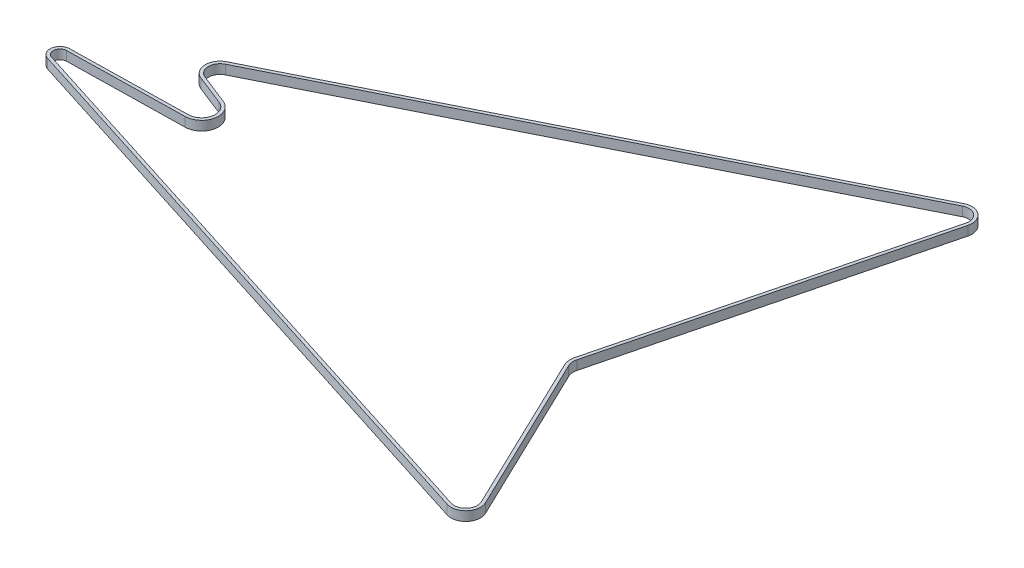
ISO-10303-21;
HEADER;
FILE_DESCRIPTION(('STEP AP214'),'2;1');
FILE_NAME('part.step','',(''),(''),'','','');
FILE_SCHEMA(('AUTOMOTIVE_DESIGN { 1 0 10303 214 1 1 1 1 }'));
ENDSEC;
DATA;
#1=APPLICATION_CONTEXT('core data for automotive mechanical design processes');
#2=APPLICATION_PROTOCOL_DEFINITION('international standard','automotive_design',2000,#1);
#3=PRODUCT_CONTEXT('',#1,'mechanical');
#4=PRODUCT('Part','Part','',(#3));
#5=PRODUCT_RELATED_PRODUCT_CATEGORY('part','',(#4));
#6=PRODUCT_DEFINITION_FORMATION('','',#4);
#7=PRODUCT_DEFINITION_CONTEXT('part definition',#1,'design');
#8=PRODUCT_DEFINITION('design','',#6,#7);
#9=PRODUCT_DEFINITION_SHAPE('','',#8);
#10=(LENGTH_UNIT() NAMED_UNIT(*) SI_UNIT(.MILLI.,.METRE.));
#11=(NAMED_UNIT(*) PLANE_ANGLE_UNIT() SI_UNIT($,.RADIAN.));
#12=(NAMED_UNIT(*) SI_UNIT($,.STERADIAN.) SOLID_ANGLE_UNIT());
#13=UNCERTAINTY_MEASURE_WITH_UNIT(LENGTH_MEASURE(1.E-05),#10,'distance_accuracy_value','');
#14=(GEOMETRIC_REPRESENTATION_CONTEXT(3) GLOBAL_UNCERTAINTY_ASSIGNED_CONTEXT((#13)) GLOBAL_UNIT_ASSIGNED_CONTEXT((#10,
#11,#12)) REPRESENTATION_CONTEXT('',''));
#15=CARTESIAN_POINT('',(0.,0.,0.));
#16=DIRECTION('',(0.,0.,1.));
#17=DIRECTION('',(1.,0.,0.));
#18=AXIS2_PLACEMENT_3D('',#15,#16,#17);
#19=CARTESIAN_POINT('',(-158.225,92.7999999999997,-9.6511576564019E-13));
#20=DIRECTION('',(0.,1.,0.));
#21=DIRECTION('',(0.,0.,1.));
#22=AXIS2_PLACEMENT_3D('',#19,#20,#21);
#23=PLANE('',#22);
#24=CARTESIAN_POINT('',(-158.225,92.7999999999997,-9.6511576564019E-13));
#25=DIRECTION('',(0.,1.,0.));
#26=DIRECTION('',(1.,0.,0.));
#27=AXIS2_PLACEMENT_3D('',#24,#25,#26);
#28=CIRCLE('',#27,9.49999999999995);
#29=CARTESIAN_POINT('',(-162.47352915725,92.7999999999997,-8.4970583145));
#30=VERTEX_POINT('',#29);
#31=CARTESIAN_POINT('',(-161.707213549348,92.7999999999997,8.83878887612533));
#32=VERTEX_POINT('',#31);
#33=EDGE_CURVE('E359',#30,#32,#28,.T.);
#34=ORIENTED_EDGE('',*,*,#33,.T.);
#35=DIRECTION('',(0.930398829065899,0.,0.366548794668329));
#36=VECTOR('',#35,1.);
#37=CARTESIAN_POINT('',(-161.707213549348,92.7999999999997,8.83878887612533));
#38=LINE('',#37,#36);
#39=CARTESIAN_POINT('',(-142.25017332858,92.7999999999997,16.5042699772744));
#40=VERTEX_POINT('',#39);
#41=EDGE_CURVE('E362',#32,#40,#38,.T.);
#42=ORIENTED_EDGE('',*,*,#41,.T.);
#43=CARTESIAN_POINT('',(-145.457475281927,92.7999999999997,24.6452597316012));
#44=DIRECTION('',(0.,1.,0.));
#45=DIRECTION('',(1.,0.,0.));
#46=AXIS2_PLACEMENT_3D('',#43,#44,#45);
#47=CIRCLE('',#46,8.75);
#48=CARTESIAN_POINT('',(-145.296171508246,92.7999999999997,33.3937728105533));
#49=VERTEX_POINT('',#48);
#50=EDGE_CURVE('E365',#40,#49,#47,.F.);
#51=ORIENTED_EDGE('',*,*,#50,.T.);
#52=DIRECTION('',(-0.999830066165956,0.,0.0184347169921266));
#53=VECTOR('',#52,1.);
#54=CARTESIAN_POINT('',(-145.296171508246,92.7999999999997,33.3937728105533));
#55=LINE('',#54,#53);
#56=CARTESIAN_POINT('',(-220.267521320825,92.7999999999997,34.7760833281921));
#57=VERTEX_POINT('',#56);
#58=EDGE_CURVE('E367',#49,#57,#55,.T.);
#59=ORIENTED_EDGE('',*,*,#58,.T.);
#60=CARTESIAN_POINT('',(-220.15,92.7999999999997,41.15));
#61=DIRECTION('',(0.,1.,0.));
#62=DIRECTION('',(1.,0.,0.));
#63=AXIS2_PLACEMENT_3D('',#60,#61,#62);
#64=CIRCLE('',#63,6.375);
#65=CARTESIAN_POINT('',(-222.082372691016,92.7999999999997,47.2250770186901));
#66=VERTEX_POINT('',#65);
#67=EDGE_CURVE('E369',#57,#66,#64,.T.);
#68=ORIENTED_EDGE('',*,*,#67,.T.);
#69=DIRECTION('',(0.952953257833734,0.,0.303117284865236));
#70=VECTOR('',#69,1.);
#71=CARTESIAN_POINT('',(-222.082372691016,92.7999999999997,47.2250770186901));
#72=LINE('',#71,#70);
#73=CARTESIAN_POINT('',(155.345385793781,92.7999999999997,167.27805594942));
#74=VERTEX_POINT('',#73);
#75=EDGE_CURVE('E371',#66,#74,#72,.T.);
#76=ORIENTED_EDGE('',*,*,#75,.T.);
#77=CARTESIAN_POINT('',(158.225,92.7999999999997,158.224999999999));
#78=DIRECTION('',(0.,1.,0.));
#79=DIRECTION('',(1.,0.,0.));
#80=AXIS2_PLACEMENT_3D('',#77,#78,#79);
#81=CIRCLE('',#80,9.49999999999991);
#82=CARTESIAN_POINT('',(166.786864341702,92.7999999999997,154.108632791612));
#83=VERTEX_POINT('',#82);
#84=EDGE_CURVE('E373',#74,#83,#81,.T.);
#85=ORIENTED_EDGE('',*,*,#84,.T.);
#86=DIRECTION('',(-0.433301811409341,0.,-0.901248878073856));
#87=VECTOR('',#86,1.);
#88=CARTESIAN_POINT('',(117.114072316854,92.7999999999997,50.7913908498316));
#89=LINE('',#88,#87);
#90=CARTESIAN_POINT('',(117.114072316854,92.7999999999997,50.7913908498316));
#91=VERTEX_POINT('',#90);
#92=EDGE_CURVE('E375',#83,#91,#89,.T.);
#93=ORIENTED_EDGE('',*,*,#92,.T.);
#94=CARTESIAN_POINT('',(125.,92.7999999999997,47.));
#95=DIRECTION('',(0.,1.,0.));
#96=DIRECTION('',(1.,0.,0.));
#97=AXIS2_PLACEMENT_3D('',#94,#95,#96);
#98=CIRCLE('',#97,8.75);
#99=CARTESIAN_POINT('',(116.518563148417,92.7999999999997,44.8487843128574));
#100=VERTEX_POINT('',#99);
#101=EDGE_CURVE('E377',#91,#100,#98,.F.);
#102=ORIENTED_EDGE('',*,*,#101,.T.);
#103=DIRECTION('',(0.245853221387726,0.,-0.969307068752353));
#104=VECTOR('',#103,1.);
#105=CARTESIAN_POINT('',(167.433417153147,92.7999999999997,-155.889394396817));
#106=LINE('',#105,#104);
#107=CARTESIAN_POINT('',(167.433417153147,92.7999999999997,-155.889394396817));
#108=VERTEX_POINT('',#107);
#109=EDGE_CURVE('E379',#100,#108,#106,.T.);
#110=ORIENTED_EDGE('',*,*,#109,.T.);
#111=CARTESIAN_POINT('',(158.225000000001,92.7999999999997,-158.225000000001));
#112=DIRECTION('',(0.,1.,0.));
#113=DIRECTION('',(1.,0.,0.));
#114=AXIS2_PLACEMENT_3D('',#111,#112,#113);
#115=CIRCLE('',#114,9.49999999999901);
#116=CARTESIAN_POINT('',(153.97647084275,92.7999999999997,-166.722058314499));
#117=VERTEX_POINT('',#116);
#118=EDGE_CURVE('E381',#108,#117,#115,.T.);
#119=ORIENTED_EDGE('',*,*,#118,.T.);
#120=DIRECTION('',(-0.894427190999917,0.,0.447213595499956));
#121=VECTOR('',#120,1.);
#122=CARTESIAN_POINT('',(-162.47352915725,92.7999999999997,-8.4970583145));
#123=LINE('',#122,#121);
#124=EDGE_CURVE('E383',#117,#30,#123,.T.);
#125=ORIENTED_EDGE('',*,*,#124,.T.);
#126=EDGE_LOOP('',(#34,#42,#51,#59,#68,#76,#85,#93,#102,#110,#119,#125));
#127=FACE_BOUND('',#126,.T.);
#128=DIRECTION('',(0.930398829065899,0.,0.366548794668329));
#129=VECTOR('',#128,1.);
#130=CARTESIAN_POINT('',(-160.974115960012,92.7999999999997,6.97799121799353));
#131=LINE('',#130,#129);
#132=CARTESIAN_POINT('',(-160.974115960012,92.7999999999997,6.97799121799353));
#133=VERTEX_POINT('',#132);
#134=CARTESIAN_POINT('',(-141.517075739243,92.7999999999997,14.6434723191426));
#135=VERTEX_POINT('',#134);
#136=EDGE_CURVE('E274',#133,#135,#131,.T.);
#137=ORIENTED_EDGE('',*,*,#136,.F.);
#138=CARTESIAN_POINT('',(-158.225,92.7999999999997,-9.6511576564019E-13));
#139=DIRECTION('',(0.,1.,0.));
#140=DIRECTION('',(0.,0.,1.));
#141=AXIS2_PLACEMENT_3D('',#138,#139,#140);
#142=CIRCLE('',#141,7.49999999999995);
#143=CARTESIAN_POINT('',(-161.57910196625,92.7999999999997,-6.70820393250017));
#144=VERTEX_POINT('',#143);
#145=EDGE_CURVE('E266',#144,#133,#142,.T.);
#146=ORIENTED_EDGE('',*,*,#145,.F.);
#147=DIRECTION('',(-0.894427190999917,0.,0.447213595499956));
#148=VECTOR('',#147,1.);
#149=CARTESIAN_POINT('',(-161.57910196625,92.7999999999997,-6.70820393250017));
#150=LINE('',#149,#148);
#151=CARTESIAN_POINT('',(154.87089803375,92.7999999999997,-164.933203932499));
#152=VERTEX_POINT('',#151);
#153=EDGE_CURVE('E307',#152,#144,#150,.T.);
#154=ORIENTED_EDGE('',*,*,#153,.F.);
#155=CARTESIAN_POINT('',(158.225000000001,92.7999999999997,-158.225000000001));
#156=DIRECTION('',(0.,1.,0.));
#157=DIRECTION('',(0.,0.,1.));
#158=AXIS2_PLACEMENT_3D('',#155,#156,#157);
#159=CIRCLE('',#158,7.49999999999901);
#160=CARTESIAN_POINT('',(165.494803015642,92.7999999999997,-156.381100839592));
#161=VERTEX_POINT('',#160);
#162=EDGE_CURVE('E305',#161,#152,#159,.T.);
#163=ORIENTED_EDGE('',*,*,#162,.F.);
#164=DIRECTION('',(0.245853221387726,0.,-0.969307068752352));
#165=VECTOR('',#164,1.);
#166=CARTESIAN_POINT('',(165.494803015642,92.7999999999997,-156.381100839592));
#167=LINE('',#166,#165);
#168=CARTESIAN_POINT('',(114.579949010912,92.7999999999997,44.3570778700819));
#169=VERTEX_POINT('',#168);
#170=EDGE_CURVE('E303',#169,#161,#167,.T.);
#171=ORIENTED_EDGE('',*,*,#170,.F.);
#172=CARTESIAN_POINT('',(125.,92.7999999999997,47.));
#173=DIRECTION('',(0.,-1.,0.));
#174=DIRECTION('',(0.,0.,1.));
#175=AXIS2_PLACEMENT_3D('',#172,#173,#174);
#176=CIRCLE('',#175,10.75);
#177=CARTESIAN_POINT('',(115.311574560706,92.7999999999997,51.6579944726503));
#178=VERTEX_POINT('',#177);
#179=EDGE_CURVE('E301',#178,#169,#176,.T.);
#180=ORIENTED_EDGE('',*,*,#179,.F.);
#181=DIRECTION('',(-0.433301811409341,0.,-0.901248878073856));
#182=VECTOR('',#181,1.);
#183=CARTESIAN_POINT('',(115.311574560706,92.7999999999997,51.6579944726503));
#184=LINE('',#183,#182);
#185=CARTESIAN_POINT('',(164.984366585554,92.7999999999997,154.97523641443));
#186=VERTEX_POINT('',#185);
#187=EDGE_CURVE('E299',#186,#178,#184,.T.);
#188=ORIENTED_EDGE('',*,*,#187,.F.);
#189=CARTESIAN_POINT('',(158.225,92.7999999999997,158.224999999999));
#190=DIRECTION('',(0.,1.,0.));
#191=DIRECTION('',(0.,0.,1.));
#192=AXIS2_PLACEMENT_3D('',#189,#190,#191);
#193=CIRCLE('',#192,7.49999999999991);
#194=CARTESIAN_POINT('',(155.951620363511,92.7999999999997,165.372149433752));
#195=VERTEX_POINT('',#194);
#196=EDGE_CURVE('E297',#195,#186,#193,.T.);
#197=ORIENTED_EDGE('',*,*,#196,.F.);
#198=DIRECTION('',(0.952953257833734,0.,0.303117284865236));
#199=VECTOR('',#198,1.);
#200=CARTESIAN_POINT('',(-221.476138121285,92.7999999999997,45.3191705030226));
#201=LINE('',#200,#199);
#202=CARTESIAN_POINT('',(-221.476138121285,92.7999999999997,45.3191705030226));
#203=VERTEX_POINT('',#202);
#204=EDGE_CURVE('E295',#203,#195,#201,.T.);
#205=ORIENTED_EDGE('',*,*,#204,.F.);
#206=CARTESIAN_POINT('',(-220.15,92.7999999999997,41.15));
#207=DIRECTION('',(0.,1.,0.));
#208=DIRECTION('',(0.,0.,1.));
#209=AXIS2_PLACEMENT_3D('',#206,#207,#208);
#210=CIRCLE('',#209,4.375);
#211=CARTESIAN_POINT('',(-220.23065188684,92.7999999999997,36.775743460524));
#212=VERTEX_POINT('',#211);
#213=EDGE_CURVE('E293',#212,#203,#210,.T.);
#214=ORIENTED_EDGE('',*,*,#213,.F.);
#215=DIRECTION('',(-0.999830066165956,0.,0.0184347169921266));
#216=VECTOR('',#215,1.);
#217=CARTESIAN_POINT('',(-145.259302074262,92.7999999999997,35.3934329428853));
#218=LINE('',#217,#216);
#219=CARTESIAN_POINT('',(-145.259302074262,92.7999999999997,35.3934329428853));
#220=VERTEX_POINT('',#219);
#221=EDGE_CURVE('E289',#220,#212,#218,.T.);
#222=ORIENTED_EDGE('',*,*,#221,.F.);
#223=CARTESIAN_POINT('',(-145.457475281927,92.7999999999997,24.6452597316012));
#224=DIRECTION('',(0.,-1.,0.));
#225=DIRECTION('',(0.,0.,1.));
#226=AXIS2_PLACEMENT_3D('',#223,#224,#225);
#227=CIRCLE('',#226,10.75);
#228=EDGE_CURVE('E287',#135,#220,#227,.T.);
#229=ORIENTED_EDGE('',*,*,#228,.F.);
#230=EDGE_LOOP('',(#137,#146,#154,#163,#171,#180,#188,#197,#205,#214,#222,#229));
#231=FACE_BOUND('',#230,.T.);
#232=ADVANCED_FACE('F105',(#127,#231),#23,.T.);
#233=CARTESIAN_POINT('',(-158.225,86.7999999999997,-9.6511576564019E-13));
#234=DIRECTION('',(0.,1.,0.));
#235=DIRECTION('',(0.,0.,1.));
#236=AXIS2_PLACEMENT_3D('',#233,#234,#235);
#237=PLANE('',#236);
#238=CARTESIAN_POINT('',(-158.225,86.7999999999997,-9.6511576564019E-13));
#239=DIRECTION('',(0.,1.,0.));
#240=DIRECTION('',(1.,0.,0.));
#241=AXIS2_PLACEMENT_3D('',#238,#239,#240);
#242=CIRCLE('',#241,9.49999999999995);
#243=CARTESIAN_POINT('',(-162.47352915725,86.7999999999997,-8.4970583145));
#244=VERTEX_POINT('',#243);
#245=CARTESIAN_POINT('',(-161.707213549348,86.7999999999997,8.83878887612533));
#246=VERTEX_POINT('',#245);
#247=EDGE_CURVE('E282',#244,#246,#242,.T.);
#248=ORIENTED_EDGE('',*,*,#247,.F.);
#249=DIRECTION('',(-0.894427190999917,0.,0.447213595499956));
#250=VECTOR('',#249,1.);
#251=CARTESIAN_POINT('',(-162.47352915725,86.7999999999997,-8.4970583145));
#252=LINE('',#251,#250);
#253=CARTESIAN_POINT('',(153.97647084275,86.7999999999997,-166.722058314499));
#254=VERTEX_POINT('',#253);
#255=EDGE_CURVE('E363',#254,#244,#252,.T.);
#256=ORIENTED_EDGE('',*,*,#255,.F.);
#257=CARTESIAN_POINT('',(158.225000000001,86.7999999999997,-158.225000000001));
#258=DIRECTION('',(0.,1.,0.));
#259=DIRECTION('',(1.,0.,0.));
#260=AXIS2_PLACEMENT_3D('',#257,#258,#259);
#261=CIRCLE('',#260,9.49999999999901);
#262=CARTESIAN_POINT('',(167.433417153147,86.7999999999997,-155.889394396817));
#263=VERTEX_POINT('',#262);
#264=EDGE_CURVE('E406',#263,#254,#261,.T.);
#265=ORIENTED_EDGE('',*,*,#264,.F.);
#266=DIRECTION('',(0.245853221387726,0.,-0.969307068752353));
#267=VECTOR('',#266,1.);
#268=CARTESIAN_POINT('',(167.433417153147,86.7999999999997,-155.889394396817));
#269=LINE('',#268,#267);
#270=CARTESIAN_POINT('',(116.518563148417,86.7999999999997,44.8487843128574));
#271=VERTEX_POINT('',#270);
#272=EDGE_CURVE('E404',#271,#263,#269,.T.);
#273=ORIENTED_EDGE('',*,*,#272,.F.);
#274=CARTESIAN_POINT('',(125.,86.7999999999997,47.));
#275=DIRECTION('',(0.,1.,0.));
#276=DIRECTION('',(1.,0.,0.));
#277=AXIS2_PLACEMENT_3D('',#274,#275,#276);
#278=CIRCLE('',#277,8.75);
#279=CARTESIAN_POINT('',(117.114072316854,86.7999999999997,50.7913908498316));
#280=VERTEX_POINT('',#279);
#281=EDGE_CURVE('E402',#280,#271,#278,.F.);
#282=ORIENTED_EDGE('',*,*,#281,.F.);
#283=DIRECTION('',(-0.433301811409341,0.,-0.901248878073856));
#284=VECTOR('',#283,1.);
#285=CARTESIAN_POINT('',(117.114072316854,86.7999999999997,50.7913908498316));
#286=LINE('',#285,#284);
#287=CARTESIAN_POINT('',(166.786864341702,86.7999999999997,154.108632791612));
#288=VERTEX_POINT('',#287);
#289=EDGE_CURVE('E400',#288,#280,#286,.T.);
#290=ORIENTED_EDGE('',*,*,#289,.F.);
#291=CARTESIAN_POINT('',(158.225,86.7999999999997,158.224999999999));
#292=DIRECTION('',(0.,1.,0.));
#293=DIRECTION('',(1.,0.,0.));
#294=AXIS2_PLACEMENT_3D('',#291,#292,#293);
#295=CIRCLE('',#294,9.49999999999991);
#296=CARTESIAN_POINT('',(155.345385793781,86.7999999999997,167.27805594942));
#297=VERTEX_POINT('',#296);
#298=EDGE_CURVE('E398',#297,#288,#295,.T.);
#299=ORIENTED_EDGE('',*,*,#298,.F.);
#300=DIRECTION('',(0.952953257833734,0.,0.303117284865236));
#301=VECTOR('',#300,1.);
#302=CARTESIAN_POINT('',(-222.082372691016,86.7999999999997,47.2250770186901));
#303=LINE('',#302,#301);
#304=CARTESIAN_POINT('',(-222.082372691016,86.7999999999997,47.2250770186901));
#305=VERTEX_POINT('',#304);
#306=EDGE_CURVE('E396',#305,#297,#303,.T.);
#307=ORIENTED_EDGE('',*,*,#306,.F.);
#308=CARTESIAN_POINT('',(-220.15,86.7999999999997,41.15));
#309=DIRECTION('',(0.,1.,0.));
#310=DIRECTION('',(1.,0.,0.));
#311=AXIS2_PLACEMENT_3D('',#308,#309,#310);
#312=CIRCLE('',#311,6.375);
#313=CARTESIAN_POINT('',(-220.267521320825,86.7999999999997,34.7760833281921));
#314=VERTEX_POINT('',#313);
#315=EDGE_CURVE('E394',#314,#305,#312,.T.);
#316=ORIENTED_EDGE('',*,*,#315,.F.);
#317=DIRECTION('',(-0.999830066165956,0.,0.0184347169921266));
#318=VECTOR('',#317,1.);
#319=CARTESIAN_POINT('',(-145.296171508246,86.7999999999997,33.3937728105533));
#320=LINE('',#319,#318);
#321=CARTESIAN_POINT('',(-145.296171508246,86.7999999999997,33.3937728105533));
#322=VERTEX_POINT('',#321);
#323=EDGE_CURVE('E392',#322,#314,#320,.T.);
#324=ORIENTED_EDGE('',*,*,#323,.F.);
#325=CARTESIAN_POINT('',(-145.457475281927,86.7999999999997,24.6452597316012));
#326=DIRECTION('',(0.,1.,0.));
#327=DIRECTION('',(1.,0.,0.));
#328=AXIS2_PLACEMENT_3D('',#325,#326,#327);
#329=CIRCLE('',#328,8.75);
#330=CARTESIAN_POINT('',(-142.25017332858,86.7999999999997,16.5042699772744));
#331=VERTEX_POINT('',#330);
#332=EDGE_CURVE('E390',#331,#322,#329,.F.);
#333=ORIENTED_EDGE('',*,*,#332,.F.);
#334=DIRECTION('',(0.930398829065899,0.,0.366548794668329));
#335=VECTOR('',#334,1.);
#336=CARTESIAN_POINT('',(-161.707213549348,86.7999999999997,8.83878887612533));
#337=LINE('',#336,#335);
#338=EDGE_CURVE('E388',#246,#331,#337,.T.);
#339=ORIENTED_EDGE('',*,*,#338,.F.);
#340=EDGE_LOOP('',(#248,#256,#265,#273,#282,#290,#299,#307,#316,#324,#333,#339));
#341=FACE_BOUND('',#340,.T.);
#342=CARTESIAN_POINT('',(-158.225,86.7999999999997,-9.6511576564019E-13));
#343=DIRECTION('',(0.,1.,0.));
#344=DIRECTION('',(0.,0.,1.));
#345=AXIS2_PLACEMENT_3D('',#342,#343,#344);
#346=CIRCLE('',#345,7.49999999999995);
#347=CARTESIAN_POINT('',(-161.57910196625,86.7999999999997,-6.70820393250016));
#348=VERTEX_POINT('',#347);
#349=CARTESIAN_POINT('',(-160.974115960012,86.7999999999997,6.97799121799353));
#350=VERTEX_POINT('',#349);
#351=EDGE_CURVE('E128',#348,#350,#346,.T.);
#352=ORIENTED_EDGE('',*,*,#351,.T.);
#353=DIRECTION('',(0.930398829065899,0.,0.366548794668329));
#354=VECTOR('',#353,1.);
#355=CARTESIAN_POINT('',(-160.974115960012,86.7999999999997,6.97799121799353));
#356=LINE('',#355,#354);
#357=CARTESIAN_POINT('',(-141.517075739243,86.7999999999997,14.6434723191426));
#358=VERTEX_POINT('',#357);
#359=EDGE_CURVE('E281',#350,#358,#356,.T.);
#360=ORIENTED_EDGE('',*,*,#359,.T.);
#361=CARTESIAN_POINT('',(-145.457475281927,86.7999999999997,24.6452597316012));
#362=DIRECTION('',(0.,-1.,0.));
#363=DIRECTION('',(0.,0.,1.));
#364=AXIS2_PLACEMENT_3D('',#361,#362,#363);
#365=CIRCLE('',#364,10.75);
#366=CARTESIAN_POINT('',(-145.259302074262,86.7999999999997,35.3934329428853));
#367=VERTEX_POINT('',#366);
#368=EDGE_CURVE('E311',#358,#367,#365,.T.);
#369=ORIENTED_EDGE('',*,*,#368,.T.);
#370=DIRECTION('',(-0.999830066165956,0.,0.0184347169921266));
#371=VECTOR('',#370,1.);
#372=CARTESIAN_POINT('',(-145.259302074262,86.7999999999997,35.3934329428853));
#373=LINE('',#372,#371);
#374=CARTESIAN_POINT('',(-220.23065188684,86.7999999999997,36.775743460524));
#375=VERTEX_POINT('',#374);
#376=EDGE_CURVE('E314',#367,#375,#373,.T.);
#377=ORIENTED_EDGE('',*,*,#376,.T.);
#378=CARTESIAN_POINT('',(-220.15,86.7999999999997,41.15));
#379=DIRECTION('',(0.,1.,0.));
#380=DIRECTION('',(0.,0.,1.));
#381=AXIS2_PLACEMENT_3D('',#378,#379,#380);
#382=CIRCLE('',#381,4.375);
#383=CARTESIAN_POINT('',(-221.476138121285,86.7999999999997,45.3191705030226));
#384=VERTEX_POINT('',#383);
#385=EDGE_CURVE('E317',#375,#384,#382,.T.);
#386=ORIENTED_EDGE('',*,*,#385,.T.);
#387=DIRECTION('',(0.952953257833734,0.,0.303117284865236));
#388=VECTOR('',#387,1.);
#389=CARTESIAN_POINT('',(-221.476138121285,86.7999999999997,45.3191705030226));
#390=LINE('',#389,#388);
#391=CARTESIAN_POINT('',(155.951620363511,86.7999999999997,165.372149433752));
#392=VERTEX_POINT('',#391);
#393=EDGE_CURVE('E320',#384,#392,#390,.T.);
#394=ORIENTED_EDGE('',*,*,#393,.T.);
#395=CARTESIAN_POINT('',(158.225,86.7999999999997,158.224999999999));
#396=DIRECTION('',(0.,1.,0.));
#397=DIRECTION('',(0.,0.,1.));
#398=AXIS2_PLACEMENT_3D('',#395,#396,#397);
#399=CIRCLE('',#398,7.49999999999991);
#400=CARTESIAN_POINT('',(164.984366585554,86.7999999999997,154.97523641443));
#401=VERTEX_POINT('',#400);
#402=EDGE_CURVE('E323',#392,#401,#399,.T.);
#403=ORIENTED_EDGE('',*,*,#402,.T.);
#404=DIRECTION('',(-0.433301811409341,0.,-0.901248878073856));
#405=VECTOR('',#404,1.);
#406=CARTESIAN_POINT('',(115.311574560706,86.7999999999997,51.6579944726503));
#407=LINE('',#406,#405);
#408=CARTESIAN_POINT('',(115.311574560706,86.7999999999997,51.6579944726503));
#409=VERTEX_POINT('',#408);
#410=EDGE_CURVE('E326',#401,#409,#407,.T.);
#411=ORIENTED_EDGE('',*,*,#410,.T.);
#412=CARTESIAN_POINT('',(125.,86.7999999999997,47.));
#413=DIRECTION('',(0.,-1.,0.));
#414=DIRECTION('',(0.,0.,1.));
#415=AXIS2_PLACEMENT_3D('',#412,#413,#414);
#416=CIRCLE('',#415,10.75);
#417=CARTESIAN_POINT('',(114.579949010912,86.7999999999997,44.3570778700819));
#418=VERTEX_POINT('',#417);
#419=EDGE_CURVE('E329',#409,#418,#416,.T.);
#420=ORIENTED_EDGE('',*,*,#419,.T.);
#421=DIRECTION('',(0.245853221387726,0.,-0.969307068752352));
#422=VECTOR('',#421,1.);
#423=CARTESIAN_POINT('',(165.494803015642,86.7999999999997,-156.381100839592));
#424=LINE('',#423,#422);
#425=CARTESIAN_POINT('',(165.494803015642,86.7999999999997,-156.381100839592));
#426=VERTEX_POINT('',#425);
#427=EDGE_CURVE('E332',#418,#426,#424,.T.);
#428=ORIENTED_EDGE('',*,*,#427,.T.);
#429=CARTESIAN_POINT('',(158.225000000001,86.7999999999997,-158.225000000001));
#430=DIRECTION('',(0.,1.,0.));
#431=DIRECTION('',(0.,0.,1.));
#432=AXIS2_PLACEMENT_3D('',#429,#430,#431);
#433=CIRCLE('',#432,7.49999999999901);
#434=CARTESIAN_POINT('',(154.87089803375,86.7999999999997,-164.933203932499));
#435=VERTEX_POINT('',#434);
#436=EDGE_CURVE('E335',#426,#435,#433,.T.);
#437=ORIENTED_EDGE('',*,*,#436,.T.);
#438=DIRECTION('',(-0.894427190999917,0.,0.447213595499956));
#439=VECTOR('',#438,1.);
#440=CARTESIAN_POINT('',(-161.57910196625,86.7999999999997,-6.70820393250017));
#441=LINE('',#440,#439);
#442=EDGE_CURVE('E275',#435,#348,#441,.T.);
#443=ORIENTED_EDGE('',*,*,#442,.T.);
#444=EDGE_LOOP('',(#352,#360,#369,#377,#386,#394,#403,#411,#420,#428,#437,#443));
#445=FACE_BOUND('',#444,.T.);
#446=ADVANCED_FACE('F448',(#341,#445),#237,.F.);
#447=CARTESIAN_POINT('',(-158.225,92.7999999999997,-9.6511576564019E-13));
#448=DIRECTION('',(0.,-1.,0.));
#449=DIRECTION('',(0.,0.,-1.));
#450=AXIS2_PLACEMENT_3D('',#447,#448,#449);
#451=CYLINDRICAL_SURFACE('',#450,9.49999999999995);
#452=ORIENTED_EDGE('',*,*,#247,.T.);
#453=DIRECTION('',(0.,-1.,0.));
#454=VECTOR('',#453,1.);
#455=CARTESIAN_POINT('',(-161.707213549348,92.7999999999997,8.83878887612533));
#456=LINE('',#455,#454);
#457=EDGE_CURVE('E12',#32,#246,#456,.T.);
#458=ORIENTED_EDGE('',*,*,#457,.F.);
#459=ORIENTED_EDGE('',*,*,#33,.F.);
#460=DIRECTION('',(0.,-1.,0.));
#461=VECTOR('',#460,1.);
#462=CARTESIAN_POINT('',(-162.47352915725,92.7999999999997,-8.4970583145));
#463=LINE('',#462,#461);
#464=EDGE_CURVE('E385',#30,#244,#463,.T.);
#465=ORIENTED_EDGE('',*,*,#464,.T.);
#466=EDGE_LOOP('',(#452,#458,#459,#465));
#467=FACE_BOUND('',#466,.T.);
#468=ADVANCED_FACE('F107',(#467),#451,.T.);
#469=CARTESIAN_POINT('',(-161.707213549348,92.7999999999997,8.83878887612533));
#470=DIRECTION('',(0.366548794668329,0.,-0.930398829065899));
#471=DIRECTION('',(-0.930398829065899,0.,-0.366548794668329));
#472=AXIS2_PLACEMENT_3D('',#469,#470,#471);
#473=PLANE('',#472);
#474=ORIENTED_EDGE('',*,*,#338,.T.);
#475=DIRECTION('',(0.,-1.,0.));
#476=VECTOR('',#475,1.);
#477=CARTESIAN_POINT('',(-142.25017332858,92.7999999999997,16.5042699772744));
#478=LINE('',#477,#476);
#479=EDGE_CURVE('E113',#40,#331,#478,.T.);
#480=ORIENTED_EDGE('',*,*,#479,.F.);
#481=ORIENTED_EDGE('',*,*,#41,.F.);
#482=ORIENTED_EDGE('',*,*,#457,.T.);
#483=EDGE_LOOP('',(#474,#480,#481,#482));
#484=FACE_BOUND('',#483,.T.);
#485=ADVANCED_FACE('F465',(#484),#473,.F.);
#486=CARTESIAN_POINT('',(-145.457475281927,92.7999999999997,24.6452597316012));
#487=DIRECTION('',(0.,-1.,0.));
#488=DIRECTION('',(0.,0.,-1.));
#489=AXIS2_PLACEMENT_3D('',#486,#487,#488);
#490=CYLINDRICAL_SURFACE('',#489,8.75);
#491=ORIENTED_EDGE('',*,*,#332,.T.);
#492=DIRECTION('',(0.,-1.,0.));
#493=VECTOR('',#492,1.);
#494=CARTESIAN_POINT('',(-145.296171508246,92.7999999999997,33.3937728105533));
#495=LINE('',#494,#493);
#496=EDGE_CURVE('E435',#49,#322,#495,.T.);
#497=ORIENTED_EDGE('',*,*,#496,.F.);
#498=ORIENTED_EDGE('',*,*,#50,.F.);
#499=ORIENTED_EDGE('',*,*,#479,.T.);
#500=EDGE_LOOP('',(#491,#497,#498,#499));
#501=FACE_BOUND('',#500,.T.);
#502=ADVANCED_FACE('F442',(#501),#490,.F.);
#503=CARTESIAN_POINT('',(-145.296171508246,92.7999999999997,33.3937728105533));
#504=DIRECTION('',(0.0184347169921266,0.,0.999830066165956));
#505=DIRECTION('',(0.999830066165956,0.,-0.0184347169921266));
#506=AXIS2_PLACEMENT_3D('',#503,#504,#505);
#507=PLANE('',#506);
#508=ORIENTED_EDGE('',*,*,#323,.T.);
#509=DIRECTION('',(0.,-1.,0.));
#510=VECTOR('',#509,1.);
#511=CARTESIAN_POINT('',(-220.267521320825,92.7999999999997,34.7760833281921));
#512=LINE('',#511,#510);
#513=EDGE_CURVE('E432',#57,#314,#512,.T.);
#514=ORIENTED_EDGE('',*,*,#513,.F.);
#515=ORIENTED_EDGE('',*,*,#58,.F.);
#516=ORIENTED_EDGE('',*,*,#496,.T.);
#517=EDGE_LOOP('',(#508,#514,#515,#516));
#518=FACE_BOUND('',#517,.T.);
#519=ADVANCED_FACE('F454',(#518),#507,.F.);
#520=CARTESIAN_POINT('',(-220.15,92.7999999999997,41.15));
#521=DIRECTION('',(0.,-1.,0.));
#522=DIRECTION('',(0.,0.,-1.));
#523=AXIS2_PLACEMENT_3D('',#520,#521,#522);
#524=CYLINDRICAL_SURFACE('',#523,6.375);
#525=ORIENTED_EDGE('',*,*,#315,.T.);
#526=DIRECTION('',(0.,-1.,0.));
#527=VECTOR('',#526,1.);
#528=CARTESIAN_POINT('',(-222.082372691016,92.7999999999997,47.2250770186901));
#529=LINE('',#528,#527);
#530=EDGE_CURVE('E429',#66,#305,#529,.T.);
#531=ORIENTED_EDGE('',*,*,#530,.F.);
#532=ORIENTED_EDGE('',*,*,#67,.F.);
#533=ORIENTED_EDGE('',*,*,#513,.T.);
#534=EDGE_LOOP('',(#525,#531,#532,#533));
#535=FACE_BOUND('',#534,.T.);
#536=ADVANCED_FACE('F458',(#535),#524,.T.);
#537=CARTESIAN_POINT('',(-222.082372691016,92.7999999999997,47.2250770186901));
#538=DIRECTION('',(0.303117284865236,0.,-0.952953257833734));
#539=DIRECTION('',(-0.952953257833734,0.,-0.303117284865236));
#540=AXIS2_PLACEMENT_3D('',#537,#538,#539);
#541=PLANE('',#540);
#542=ORIENTED_EDGE('',*,*,#306,.T.);
#543=DIRECTION('',(0.,-1.,0.));
#544=VECTOR('',#543,1.);
#545=CARTESIAN_POINT('',(155.345385793781,92.7999999999997,167.27805594942));
#546=LINE('',#545,#544);
#547=EDGE_CURVE('E426',#74,#297,#546,.T.);
#548=ORIENTED_EDGE('',*,*,#547,.F.);
#549=ORIENTED_EDGE('',*,*,#75,.F.);
#550=ORIENTED_EDGE('',*,*,#530,.T.);
#551=EDGE_LOOP('',(#542,#548,#549,#550));
#552=FACE_BOUND('',#551,.T.);
#553=ADVANCED_FACE('F498',(#552),#541,.F.);
#554=CARTESIAN_POINT('',(158.225,92.7999999999997,158.224999999999));
#555=DIRECTION('',(0.,-1.,0.));
#556=DIRECTION('',(0.,0.,-1.));
#557=AXIS2_PLACEMENT_3D('',#554,#555,#556);
#558=CYLINDRICAL_SURFACE('',#557,9.49999999999991);
#559=ORIENTED_EDGE('',*,*,#298,.T.);
#560=DIRECTION('',(0.,-1.,0.));
#561=VECTOR('',#560,1.);
#562=CARTESIAN_POINT('',(166.786864341702,92.7999999999997,154.108632791612));
#563=LINE('',#562,#561);
#564=EDGE_CURVE('E423',#83,#288,#563,.T.);
#565=ORIENTED_EDGE('',*,*,#564,.F.);
#566=ORIENTED_EDGE('',*,*,#84,.F.);
#567=ORIENTED_EDGE('',*,*,#547,.T.);
#568=EDGE_LOOP('',(#559,#565,#566,#567));
#569=FACE_BOUND('',#568,.T.);
#570=ADVANCED_FACE('F496',(#569),#558,.T.);
#571=CARTESIAN_POINT('',(117.114072316854,92.7999999999997,50.7913908498316));
#572=DIRECTION('',(-0.901248878073856,0.,0.433301811409341));
#573=DIRECTION('',(0.433301811409341,0.,0.901248878073856));
#574=AXIS2_PLACEMENT_3D('',#571,#572,#573);
#575=PLANE('',#574);
#576=ORIENTED_EDGE('',*,*,#289,.T.);
#577=DIRECTION('',(0.,-1.,0.));
#578=VECTOR('',#577,1.);
#579=CARTESIAN_POINT('',(117.114072316854,92.7999999999997,50.7913908498316));
#580=LINE('',#579,#578);
#581=EDGE_CURVE('E420',#91,#280,#580,.T.);
#582=ORIENTED_EDGE('',*,*,#581,.F.);
#583=ORIENTED_EDGE('',*,*,#92,.F.);
#584=ORIENTED_EDGE('',*,*,#564,.T.);
#585=EDGE_LOOP('',(#576,#582,#583,#584));
#586=FACE_BOUND('',#585,.T.);
#587=ADVANCED_FACE('F492',(#586),#575,.F.);
#588=CARTESIAN_POINT('',(125.,92.7999999999997,47.));
#589=DIRECTION('',(0.,-1.,0.));
#590=DIRECTION('',(0.,0.,-1.));
#591=AXIS2_PLACEMENT_3D('',#588,#589,#590);
#592=CYLINDRICAL_SURFACE('',#591,8.75);
#593=ORIENTED_EDGE('',*,*,#281,.T.);
#594=DIRECTION('',(0.,-1.,0.));
#595=VECTOR('',#594,1.);
#596=CARTESIAN_POINT('',(116.518563148417,92.7999999999997,44.8487843128574));
#597=LINE('',#596,#595);
#598=EDGE_CURVE('E417',#100,#271,#597,.T.);
#599=ORIENTED_EDGE('',*,*,#598,.F.);
#600=ORIENTED_EDGE('',*,*,#101,.F.);
#601=ORIENTED_EDGE('',*,*,#581,.T.);
#602=EDGE_LOOP('',(#593,#599,#600,#601));
#603=FACE_BOUND('',#602,.T.);
#604=ADVANCED_FACE('F487',(#603),#592,.F.);
#605=CARTESIAN_POINT('',(167.433417153147,92.7999999999997,-155.889394396817));
#606=DIRECTION('',(-0.969307068752353,0.,-0.245853221387726));
#607=DIRECTION('',(-0.245853221387726,0.,0.969307068752353));
#608=AXIS2_PLACEMENT_3D('',#605,#606,#607);
#609=PLANE('',#608);
#610=ORIENTED_EDGE('',*,*,#272,.T.);
#611=DIRECTION('',(0.,-1.,0.));
#612=VECTOR('',#611,1.);
#613=CARTESIAN_POINT('',(167.433417153147,92.7999999999997,-155.889394396817));
#614=LINE('',#613,#612);
#615=EDGE_CURVE('E414',#108,#263,#614,.T.);
#616=ORIENTED_EDGE('',*,*,#615,.F.);
#617=ORIENTED_EDGE('',*,*,#109,.F.);
#618=ORIENTED_EDGE('',*,*,#598,.T.);
#619=EDGE_LOOP('',(#610,#616,#617,#618));
#620=FACE_BOUND('',#619,.T.);
#621=ADVANCED_FACE('F481',(#620),#609,.F.);
#622=CARTESIAN_POINT('',(158.225000000001,92.7999999999997,-158.225000000001));
#623=DIRECTION('',(0.,-1.,0.));
#624=DIRECTION('',(0.,0.,-1.));
#625=AXIS2_PLACEMENT_3D('',#622,#623,#624);
#626=CYLINDRICAL_SURFACE('',#625,9.49999999999901);
#627=ORIENTED_EDGE('',*,*,#264,.T.);
#628=DIRECTION('',(0.,-1.,0.));
#629=VECTOR('',#628,1.);
#630=CARTESIAN_POINT('',(153.97647084275,92.7999999999997,-166.722058314499));
#631=LINE('',#630,#629);
#632=EDGE_CURVE('E411',#117,#254,#631,.T.);
#633=ORIENTED_EDGE('',*,*,#632,.F.);
#634=ORIENTED_EDGE('',*,*,#118,.F.);
#635=ORIENTED_EDGE('',*,*,#615,.T.);
#636=EDGE_LOOP('',(#627,#633,#634,#635));
#637=FACE_BOUND('',#636,.T.);
#638=ADVANCED_FACE('F477',(#637),#626,.T.);
#639=CARTESIAN_POINT('',(-162.47352915725,92.7999999999997,-8.4970583145));
#640=DIRECTION('',(0.447213595499956,0.,0.894427190999917));
#641=DIRECTION('',(0.894427190999917,0.,-0.447213595499956));
#642=AXIS2_PLACEMENT_3D('',#639,#640,#641);
#643=PLANE('',#642);
#644=ORIENTED_EDGE('',*,*,#255,.T.);
#645=ORIENTED_EDGE('',*,*,#464,.F.);
#646=ORIENTED_EDGE('',*,*,#124,.F.);
#647=ORIENTED_EDGE('',*,*,#632,.T.);
#648=EDGE_LOOP('',(#644,#645,#646,#647));
#649=FACE_BOUND('',#648,.T.);
#650=ADVANCED_FACE('F472',(#649),#643,.F.);
#651=CARTESIAN_POINT('',(-158.225,92.7999999999997,-9.6511576564019E-13));
#652=DIRECTION('',(0.,-1.,0.));
#653=DIRECTION('',(0.,0.,-1.));
#654=AXIS2_PLACEMENT_3D('',#651,#652,#653);
#655=CYLINDRICAL_SURFACE('',#654,7.49999999999995);
#656=ORIENTED_EDGE('',*,*,#351,.F.);
#657=DIRECTION('',(0.,-1.,0.));
#658=VECTOR('',#657,1.);
#659=CARTESIAN_POINT('',(-161.57910196625,92.7999999999997,-6.70820393250017));
#660=LINE('',#659,#658);
#661=EDGE_CURVE('E270',#144,#348,#660,.T.);
#662=ORIENTED_EDGE('',*,*,#661,.F.);
#663=ORIENTED_EDGE('',*,*,#145,.T.);
#664=DIRECTION('',(0.,-1.,0.));
#665=VECTOR('',#664,1.);
#666=CARTESIAN_POINT('',(-160.974115960012,92.7999999999997,6.97799121799353));
#667=LINE('',#666,#665);
#668=EDGE_CURVE('E269',#133,#350,#667,.T.);
#669=ORIENTED_EDGE('',*,*,#668,.T.);
#670=EDGE_LOOP('',(#656,#662,#663,#669));
#671=FACE_BOUND('',#670,.T.);
#672=ADVANCED_FACE('F268',(#671),#655,.F.);
#673=CARTESIAN_POINT('',(-160.974115960012,92.7999999999997,6.97799121799353));
#674=DIRECTION('',(0.366548794668329,0.,-0.930398829065899));
#675=DIRECTION('',(-0.930398829065899,0.,-0.366548794668329));
#676=AXIS2_PLACEMENT_3D('',#673,#674,#675);
#677=PLANE('',#676);
#678=ORIENTED_EDGE('',*,*,#359,.F.);
#679=ORIENTED_EDGE('',*,*,#668,.F.);
#680=ORIENTED_EDGE('',*,*,#136,.T.);
#681=DIRECTION('',(0.,-1.,0.));
#682=VECTOR('',#681,1.);
#683=CARTESIAN_POINT('',(-141.517075739243,92.7999999999997,14.6434723191426));
#684=LINE('',#683,#682);
#685=EDGE_CURVE('E283',#135,#358,#684,.T.);
#686=ORIENTED_EDGE('',*,*,#685,.T.);
#687=EDGE_LOOP('',(#678,#679,#680,#686));
#688=FACE_BOUND('',#687,.T.);
#689=ADVANCED_FACE('F278',(#688),#677,.T.);
#690=CARTESIAN_POINT('',(-145.457475281927,92.7999999999997,24.6452597316012));
#691=DIRECTION('',(0.,-1.,0.));
#692=DIRECTION('',(0.,0.,-1.));
#693=AXIS2_PLACEMENT_3D('',#690,#691,#692);
#694=CYLINDRICAL_SURFACE('',#693,10.75);
#695=ORIENTED_EDGE('',*,*,#368,.F.);
#696=ORIENTED_EDGE('',*,*,#685,.F.);
#697=ORIENTED_EDGE('',*,*,#228,.T.);
#698=DIRECTION('',(0.,-1.,0.));
#699=VECTOR('',#698,1.);
#700=CARTESIAN_POINT('',(-145.259302074262,92.7999999999997,35.3934329428853));
#701=LINE('',#700,#699);
#702=EDGE_CURVE('E356',#220,#367,#701,.T.);
#703=ORIENTED_EDGE('',*,*,#702,.T.);
#704=EDGE_LOOP('',(#695,#696,#697,#703));
#705=FACE_BOUND('',#704,.T.);
#706=ADVANCED_FACE('F556',(#705),#694,.T.);
#707=CARTESIAN_POINT('',(-145.259302074262,92.7999999999997,35.3934329428853));
#708=DIRECTION('',(0.0184347169921266,0.,0.999830066165956));
#709=DIRECTION('',(0.999830066165956,0.,-0.0184347169921266));
#710=AXIS2_PLACEMENT_3D('',#707,#708,#709);
#711=PLANE('',#710);
#712=ORIENTED_EDGE('',*,*,#376,.F.);
#713=ORIENTED_EDGE('',*,*,#702,.F.);
#714=ORIENTED_EDGE('',*,*,#221,.T.);
#715=DIRECTION('',(0.,-1.,0.));
#716=VECTOR('',#715,1.);
#717=CARTESIAN_POINT('',(-220.23065188684,92.7999999999997,36.775743460524));
#718=LINE('',#717,#716);
#719=EDGE_CURVE('E354',#212,#375,#718,.T.);
#720=ORIENTED_EDGE('',*,*,#719,.T.);
#721=EDGE_LOOP('',(#712,#713,#714,#720));
#722=FACE_BOUND('',#721,.T.);
#723=ADVANCED_FACE('F562',(#722),#711,.T.);
#724=CARTESIAN_POINT('',(-220.15,92.7999999999997,41.15));
#725=DIRECTION('',(0.,-1.,0.));
#726=DIRECTION('',(0.,0.,-1.));
#727=AXIS2_PLACEMENT_3D('',#724,#725,#726);
#728=CYLINDRICAL_SURFACE('',#727,4.375);
#729=ORIENTED_EDGE('',*,*,#385,.F.);
#730=ORIENTED_EDGE('',*,*,#719,.F.);
#731=ORIENTED_EDGE('',*,*,#213,.T.);
#732=DIRECTION('',(0.,-1.,0.));
#733=VECTOR('',#732,1.);
#734=CARTESIAN_POINT('',(-221.476138121285,92.7999999999997,45.3191705030226));
#735=LINE('',#734,#733);
#736=EDGE_CURVE('E352',#203,#384,#735,.T.);
#737=ORIENTED_EDGE('',*,*,#736,.T.);
#738=EDGE_LOOP('',(#729,#730,#731,#737));
#739=FACE_BOUND('',#738,.T.);
#740=ADVANCED_FACE('F570',(#739),#728,.F.);
#741=CARTESIAN_POINT('',(-221.476138121285,92.7999999999997,45.3191705030226));
#742=DIRECTION('',(0.303117284865236,0.,-0.952953257833734));
#743=DIRECTION('',(-0.952953257833734,0.,-0.303117284865236));
#744=AXIS2_PLACEMENT_3D('',#741,#742,#743);
#745=PLANE('',#744);
#746=ORIENTED_EDGE('',*,*,#393,.F.);
#747=ORIENTED_EDGE('',*,*,#736,.F.);
#748=ORIENTED_EDGE('',*,*,#204,.T.);
#749=DIRECTION('',(0.,-1.,0.));
#750=VECTOR('',#749,1.);
#751=CARTESIAN_POINT('',(155.951620363511,92.7999999999997,165.372149433752));
#752=LINE('',#751,#750);
#753=EDGE_CURVE('E350',#195,#392,#752,.T.);
#754=ORIENTED_EDGE('',*,*,#753,.T.);
#755=EDGE_LOOP('',(#746,#747,#748,#754));
#756=FACE_BOUND('',#755,.T.);
#757=ADVANCED_FACE('F578',(#756),#745,.T.);
#758=CARTESIAN_POINT('',(158.225,92.7999999999997,158.224999999999));
#759=DIRECTION('',(0.,-1.,0.));
#760=DIRECTION('',(0.,0.,-1.));
#761=AXIS2_PLACEMENT_3D('',#758,#759,#760);
#762=CYLINDRICAL_SURFACE('',#761,7.49999999999991);
#763=ORIENTED_EDGE('',*,*,#402,.F.);
#764=ORIENTED_EDGE('',*,*,#753,.F.);
#765=ORIENTED_EDGE('',*,*,#196,.T.);
#766=DIRECTION('',(0.,-1.,0.));
#767=VECTOR('',#766,1.);
#768=CARTESIAN_POINT('',(164.984366585554,92.7999999999997,154.97523641443));
#769=LINE('',#768,#767);
#770=EDGE_CURVE('E348',#186,#401,#769,.T.);
#771=ORIENTED_EDGE('',*,*,#770,.T.);
#772=EDGE_LOOP('',(#763,#764,#765,#771));
#773=FACE_BOUND('',#772,.T.);
#774=ADVANCED_FACE('F586',(#773),#762,.F.);
#775=CARTESIAN_POINT('',(115.311574560706,92.7999999999997,51.6579944726503));
#776=DIRECTION('',(-0.901248878073856,0.,0.433301811409341));
#777=DIRECTION('',(0.433301811409341,0.,0.901248878073856));
#778=AXIS2_PLACEMENT_3D('',#775,#776,#777);
#779=PLANE('',#778);
#780=ORIENTED_EDGE('',*,*,#410,.F.);
#781=ORIENTED_EDGE('',*,*,#770,.F.);
#782=ORIENTED_EDGE('',*,*,#187,.T.);
#783=DIRECTION('',(0.,-1.,0.));
#784=VECTOR('',#783,1.);
#785=CARTESIAN_POINT('',(115.311574560706,92.7999999999997,51.6579944726503));
#786=LINE('',#785,#784);
#787=EDGE_CURVE('E346',#178,#409,#786,.T.);
#788=ORIENTED_EDGE('',*,*,#787,.T.);
#789=EDGE_LOOP('',(#780,#781,#782,#788));
#790=FACE_BOUND('',#789,.T.);
#791=ADVANCED_FACE('F594',(#790),#779,.T.);
#792=CARTESIAN_POINT('',(125.,92.7999999999997,47.));
#793=DIRECTION('',(0.,-1.,0.));
#794=DIRECTION('',(0.,0.,-1.));
#795=AXIS2_PLACEMENT_3D('',#792,#793,#794);
#796=CYLINDRICAL_SURFACE('',#795,10.75);
#797=ORIENTED_EDGE('',*,*,#419,.F.);
#798=ORIENTED_EDGE('',*,*,#787,.F.);
#799=ORIENTED_EDGE('',*,*,#179,.T.);
#800=DIRECTION('',(0.,-1.,0.));
#801=VECTOR('',#800,1.);
#802=CARTESIAN_POINT('',(114.579949010912,92.7999999999997,44.3570778700819));
#803=LINE('',#802,#801);
#804=EDGE_CURVE('E344',#169,#418,#803,.T.);
#805=ORIENTED_EDGE('',*,*,#804,.T.);
#806=EDGE_LOOP('',(#797,#798,#799,#805));
#807=FACE_BOUND('',#806,.T.);
#808=ADVANCED_FACE('F602',(#807),#796,.T.);
#809=CARTESIAN_POINT('',(165.494803015642,92.7999999999997,-156.381100839592));
#810=DIRECTION('',(-0.969307068752353,0.,-0.245853221387726));
#811=DIRECTION('',(-0.245853221387726,0.,0.969307068752353));
#812=AXIS2_PLACEMENT_3D('',#809,#810,#811);
#813=PLANE('',#812);
#814=ORIENTED_EDGE('',*,*,#427,.F.);
#815=ORIENTED_EDGE('',*,*,#804,.F.);
#816=ORIENTED_EDGE('',*,*,#170,.T.);
#817=DIRECTION('',(0.,-1.,0.));
#818=VECTOR('',#817,1.);
#819=CARTESIAN_POINT('',(165.494803015642,92.7999999999997,-156.381100839592));
#820=LINE('',#819,#818);
#821=EDGE_CURVE('E342',#161,#426,#820,.T.);
#822=ORIENTED_EDGE('',*,*,#821,.T.);
#823=EDGE_LOOP('',(#814,#815,#816,#822));
#824=FACE_BOUND('',#823,.T.);
#825=ADVANCED_FACE('F610',(#824),#813,.T.);
#826=CARTESIAN_POINT('',(158.225000000001,92.7999999999997,-158.225000000001));
#827=DIRECTION('',(0.,-1.,0.));
#828=DIRECTION('',(0.,0.,-1.));
#829=AXIS2_PLACEMENT_3D('',#826,#827,#828);
#830=CYLINDRICAL_SURFACE('',#829,7.49999999999901);
#831=ORIENTED_EDGE('',*,*,#436,.F.);
#832=ORIENTED_EDGE('',*,*,#821,.F.);
#833=ORIENTED_EDGE('',*,*,#162,.T.);
#834=DIRECTION('',(0.,-1.,0.));
#835=VECTOR('',#834,1.);
#836=CARTESIAN_POINT('',(154.87089803375,92.7999999999997,-164.933203932499));
#837=LINE('',#836,#835);
#838=EDGE_CURVE('E120',#152,#435,#837,.T.);
#839=ORIENTED_EDGE('',*,*,#838,.T.);
#840=EDGE_LOOP('',(#831,#832,#833,#839));
#841=FACE_BOUND('',#840,.T.);
#842=ADVANCED_FACE('F618',(#841),#830,.F.);
#843=CARTESIAN_POINT('',(-161.57910196625,92.7999999999997,-6.70820393250017));
#844=DIRECTION('',(0.447213595499956,0.,0.894427190999917));
#845=DIRECTION('',(0.894427190999917,0.,-0.447213595499956));
#846=AXIS2_PLACEMENT_3D('',#843,#844,#845);
#847=PLANE('',#846);
#848=ORIENTED_EDGE('',*,*,#442,.F.);
#849=ORIENTED_EDGE('',*,*,#838,.F.);
#850=ORIENTED_EDGE('',*,*,#153,.T.);
#851=ORIENTED_EDGE('',*,*,#661,.T.);
#852=EDGE_LOOP('',(#848,#849,#850,#851));
#853=FACE_BOUND('',#852,.T.);
#854=ADVANCED_FACE('F626',(#853),#847,.T.);
#855=CLOSED_SHELL('',(#232,#446,#468,#485,#502,#519,#536,#553,#570,#587,#604,#621,#638,#650,
#672,#689,#706,#723,#740,#757,#774,#791,#808,#825,#842,#854));
#856=MANIFOLD_SOLID_BREP('B2',#855);
#857=ADVANCED_BREP_SHAPE_REPRESENTATION('',(#18,#856),#14);
#858=SHAPE_DEFINITION_REPRESENTATION(#9,#857);
ENDSEC;
END-ISO-10303-21;
